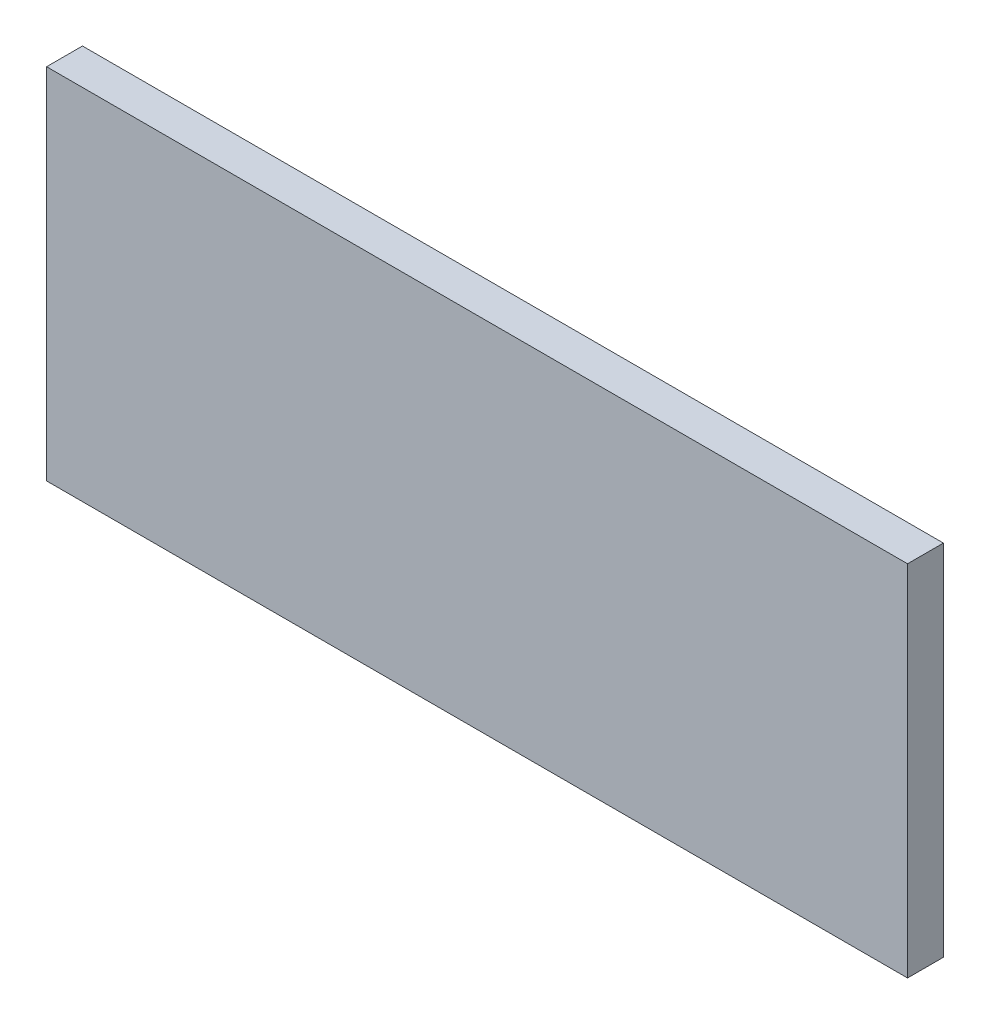
ISO-10303-21;
HEADER;
FILE_DESCRIPTION(('STEP AP214'),'2;1');
FILE_NAME('part.step','',(''),(''),'','','');
FILE_SCHEMA(('AUTOMOTIVE_DESIGN { 1 0 10303 214 1 1 1 1 }'));
ENDSEC;
DATA;
#1=APPLICATION_CONTEXT('core data for automotive mechanical design processes');
#2=APPLICATION_PROTOCOL_DEFINITION('international standard','automotive_design',2000,#1);
#3=PRODUCT_CONTEXT('',#1,'mechanical');
#4=PRODUCT('Part','Part','',(#3));
#5=PRODUCT_RELATED_PRODUCT_CATEGORY('part','',(#4));
#6=PRODUCT_DEFINITION_FORMATION('','',#4);
#7=PRODUCT_DEFINITION_CONTEXT('part definition',#1,'design');
#8=PRODUCT_DEFINITION('design','',#6,#7);
#9=PRODUCT_DEFINITION_SHAPE('','',#8);
#10=(LENGTH_UNIT() NAMED_UNIT(*) SI_UNIT(.MILLI.,.METRE.));
#11=(NAMED_UNIT(*) PLANE_ANGLE_UNIT() SI_UNIT($,.RADIAN.));
#12=(NAMED_UNIT(*) SI_UNIT($,.STERADIAN.) SOLID_ANGLE_UNIT());
#13=UNCERTAINTY_MEASURE_WITH_UNIT(LENGTH_MEASURE(1.E-05),#10,'distance_accuracy_value','');
#14=(GEOMETRIC_REPRESENTATION_CONTEXT(3) GLOBAL_UNCERTAINTY_ASSIGNED_CONTEXT((#13)) GLOBAL_UNIT_ASSIGNED_CONTEXT((#10,
#11,#12)) REPRESENTATION_CONTEXT('',''));
#15=CARTESIAN_POINT('',(0.,0.,0.));
#16=DIRECTION('',(0.,0.,1.));
#17=DIRECTION('',(1.,0.,0.));
#18=AXIS2_PLACEMENT_3D('',#15,#16,#17);
#19=CARTESIAN_POINT('',(60.,-25.,5.));
#20=DIRECTION('',(-1.,0.,0.));
#21=DIRECTION('',(0.,0.,1.));
#22=AXIS2_PLACEMENT_3D('',#19,#20,#21);
#23=PLANE('',#22);
#24=DIRECTION('',(0.,1.,0.));
#25=VECTOR('',#24,1.);
#26=CARTESIAN_POINT('',(60.,-25.,0.));
#27=LINE('',#26,#25);
#28=CARTESIAN_POINT('',(60.,-25.,0.));
#29=VERTEX_POINT('',#28);
#30=CARTESIAN_POINT('',(60.,25.,0.));
#31=VERTEX_POINT('',#30);
#32=EDGE_CURVE('E107',#29,#31,#27,.T.);
#33=ORIENTED_EDGE('',*,*,#32,.T.);
#34=DIRECTION('',(0.,0.,-1.));
#35=VECTOR('',#34,1.);
#36=CARTESIAN_POINT('',(60.,25.,5.));
#37=LINE('',#36,#35);
#38=CARTESIAN_POINT('',(60.,25.,5.));
#39=VERTEX_POINT('',#38);
#40=EDGE_CURVE('E11',#39,#31,#37,.T.);
#41=ORIENTED_EDGE('',*,*,#40,.F.);
#42=DIRECTION('',(0.,1.,0.));
#43=VECTOR('',#42,1.);
#44=CARTESIAN_POINT('',(60.,-25.,5.));
#45=LINE('',#44,#43);
#46=CARTESIAN_POINT('',(60.,-25.,5.));
#47=VERTEX_POINT('',#46);
#48=EDGE_CURVE('E91',#47,#39,#45,.T.);
#49=ORIENTED_EDGE('',*,*,#48,.F.);
#50=DIRECTION('',(0.,0.,-1.));
#51=VECTOR('',#50,1.);
#52=CARTESIAN_POINT('',(60.,-25.,5.));
#53=LINE('',#52,#51);
#54=EDGE_CURVE('E103',#47,#29,#53,.T.);
#55=ORIENTED_EDGE('',*,*,#54,.T.);
#56=EDGE_LOOP('',(#33,#41,#49,#55));
#57=FACE_BOUND('',#56,.T.);
#58=ADVANCED_FACE('F39',(#57),#23,.F.);
#59=CARTESIAN_POINT('',(-60.,25.,5.));
#60=DIRECTION('',(0.,-1.,0.));
#61=DIRECTION('',(0.,0.,-1.));
#62=AXIS2_PLACEMENT_3D('',#59,#60,#61);
#63=PLANE('',#62);
#64=DIRECTION('',(-1.,0.,0.));
#65=VECTOR('',#64,1.);
#66=CARTESIAN_POINT('',(-60.,25.,0.));
#67=LINE('',#66,#65);
#68=CARTESIAN_POINT('',(-60.,25.,0.));
#69=VERTEX_POINT('',#68);
#70=EDGE_CURVE('E96',#31,#69,#67,.T.);
#71=ORIENTED_EDGE('',*,*,#70,.T.);
#72=DIRECTION('',(0.,0.,-1.));
#73=VECTOR('',#72,1.);
#74=CARTESIAN_POINT('',(-60.,25.,5.));
#75=LINE('',#74,#73);
#76=CARTESIAN_POINT('',(-60.,25.,5.));
#77=VERTEX_POINT('',#76);
#78=EDGE_CURVE('E48',#77,#69,#75,.T.);
#79=ORIENTED_EDGE('',*,*,#78,.F.);
#80=DIRECTION('',(-1.,0.,0.));
#81=VECTOR('',#80,1.);
#82=CARTESIAN_POINT('',(-60.,25.,5.));
#83=LINE('',#82,#81);
#84=EDGE_CURVE('E86',#39,#77,#83,.T.);
#85=ORIENTED_EDGE('',*,*,#84,.F.);
#86=ORIENTED_EDGE('',*,*,#40,.T.);
#87=EDGE_LOOP('',(#71,#79,#85,#86));
#88=FACE_BOUND('',#87,.T.);
#89=ADVANCED_FACE('F95',(#88),#63,.F.);
#90=CARTESIAN_POINT('',(-60.,-25.,5.));
#91=DIRECTION('',(1.,0.,0.));
#92=DIRECTION('',(0.,0.,-1.));
#93=AXIS2_PLACEMENT_3D('',#90,#91,#92);
#94=PLANE('',#93);
#95=DIRECTION('',(0.,-1.,0.));
#96=VECTOR('',#95,1.);
#97=CARTESIAN_POINT('',(-60.,-25.,0.));
#98=LINE('',#97,#96);
#99=CARTESIAN_POINT('',(-60.,-25.,0.));
#100=VERTEX_POINT('',#99);
#101=EDGE_CURVE('E73',#69,#100,#98,.T.);
#102=ORIENTED_EDGE('',*,*,#101,.T.);
#103=DIRECTION('',(0.,0.,-1.));
#104=VECTOR('',#103,1.);
#105=CARTESIAN_POINT('',(-60.,-25.,5.));
#106=LINE('',#105,#104);
#107=CARTESIAN_POINT('',(-60.,-25.,5.));
#108=VERTEX_POINT('',#107);
#109=EDGE_CURVE('E98',#108,#100,#106,.T.);
#110=ORIENTED_EDGE('',*,*,#109,.F.);
#111=DIRECTION('',(0.,-1.,0.));
#112=VECTOR('',#111,1.);
#113=CARTESIAN_POINT('',(-60.,-25.,5.));
#114=LINE('',#113,#112);
#115=EDGE_CURVE('E89',#77,#108,#114,.T.);
#116=ORIENTED_EDGE('',*,*,#115,.F.);
#117=ORIENTED_EDGE('',*,*,#78,.T.);
#118=EDGE_LOOP('',(#102,#110,#116,#117));
#119=FACE_BOUND('',#118,.T.);
#120=ADVANCED_FACE('F99',(#119),#94,.F.);
#121=CARTESIAN_POINT('',(-60.,-25.,5.));
#122=DIRECTION('',(0.,1.,0.));
#123=DIRECTION('',(0.,0.,1.));
#124=AXIS2_PLACEMENT_3D('',#121,#122,#123);
#125=PLANE('',#124);
#126=DIRECTION('',(1.,0.,0.));
#127=VECTOR('',#126,1.);
#128=CARTESIAN_POINT('',(-60.,-25.,0.));
#129=LINE('',#128,#127);
#130=EDGE_CURVE('E79',#100,#29,#129,.T.);
#131=ORIENTED_EDGE('',*,*,#130,.T.);
#132=ORIENTED_EDGE('',*,*,#54,.F.);
#133=DIRECTION('',(1.,0.,0.));
#134=VECTOR('',#133,1.);
#135=CARTESIAN_POINT('',(-60.,-25.,5.));
#136=LINE('',#135,#134);
#137=EDGE_CURVE('E56',#108,#47,#136,.T.);
#138=ORIENTED_EDGE('',*,*,#137,.F.);
#139=ORIENTED_EDGE('',*,*,#109,.T.);
#140=EDGE_LOOP('',(#131,#132,#138,#139));
#141=FACE_BOUND('',#140,.T.);
#142=ADVANCED_FACE('F120',(#141),#125,.F.);
#143=CARTESIAN_POINT('',(0.,0.,5.));
#144=DIRECTION('',(0.,0.,-1.));
#145=DIRECTION('',(-1.,0.,0.));
#146=AXIS2_PLACEMENT_3D('',#143,#144,#145);
#147=PLANE('',#146);
#148=ORIENTED_EDGE('',*,*,#48,.T.);
#149=ORIENTED_EDGE('',*,*,#84,.T.);
#150=ORIENTED_EDGE('',*,*,#115,.T.);
#151=ORIENTED_EDGE('',*,*,#137,.T.);
#152=EDGE_LOOP('',(#148,#149,#150,#151));
#153=FACE_BOUND('',#152,.T.);
#154=ADVANCED_FACE('F87',(#153),#147,.F.);
#155=CARTESIAN_POINT('',(0.,0.,0.));
#156=DIRECTION('',(0.,0.,-1.));
#157=DIRECTION('',(-1.,0.,0.));
#158=AXIS2_PLACEMENT_3D('',#155,#156,#157);
#159=PLANE('',#158);
#160=ORIENTED_EDGE('',*,*,#32,.F.);
#161=ORIENTED_EDGE('',*,*,#130,.F.);
#162=ORIENTED_EDGE('',*,*,#101,.F.);
#163=ORIENTED_EDGE('',*,*,#70,.F.);
#164=EDGE_LOOP('',(#160,#161,#162,#163));
#165=FACE_BOUND('',#164,.T.);
#166=ADVANCED_FACE('F123',(#165),#159,.T.);
#167=CLOSED_SHELL('',(#58,#89,#120,#142,#154,#166));
#168=MANIFOLD_SOLID_BREP('B2',#167);
#169=ADVANCED_BREP_SHAPE_REPRESENTATION('',(#18,#168),#14);
#170=SHAPE_DEFINITION_REPRESENTATION(#9,#169);
ENDSEC;
END-ISO-10303-21;
